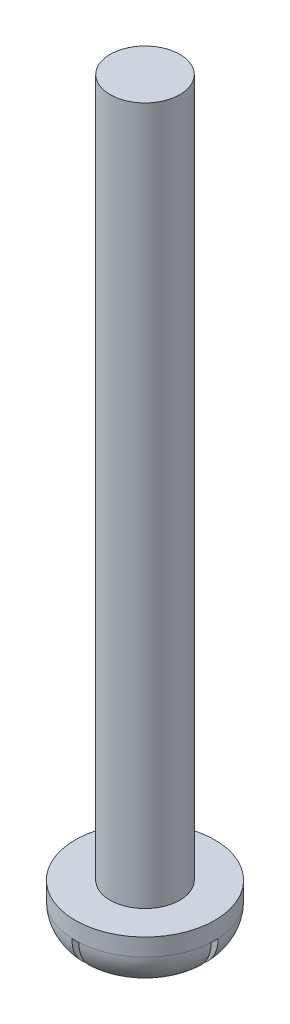
ISO-10303-21;
HEADER;
FILE_DESCRIPTION(('STEP AP214'),'2;1');
FILE_NAME('part.step','',(''),(''),'','','');
FILE_SCHEMA(('AUTOMOTIVE_DESIGN { 1 0 10303 214 1 1 1 1 }'));
ENDSEC;
DATA;
#1=APPLICATION_CONTEXT('core data for automotive mechanical design processes');
#2=APPLICATION_PROTOCOL_DEFINITION('international standard','automotive_design',2000,#1);
#3=PRODUCT_CONTEXT('',#1,'mechanical');
#4=PRODUCT('Part','Part','',(#3));
#5=PRODUCT_RELATED_PRODUCT_CATEGORY('part','',(#4));
#6=PRODUCT_DEFINITION_FORMATION('','',#4);
#7=PRODUCT_DEFINITION_CONTEXT('part definition',#1,'design');
#8=PRODUCT_DEFINITION('design','',#6,#7);
#9=PRODUCT_DEFINITION_SHAPE('','',#8);
#10=(LENGTH_UNIT() NAMED_UNIT(*) SI_UNIT(.MILLI.,.METRE.));
#11=(NAMED_UNIT(*) PLANE_ANGLE_UNIT() SI_UNIT($,.RADIAN.));
#12=(NAMED_UNIT(*) SI_UNIT($,.STERADIAN.) SOLID_ANGLE_UNIT());
#13=UNCERTAINTY_MEASURE_WITH_UNIT(LENGTH_MEASURE(1.E-05),#10,'distance_accuracy_value','');
#14=(GEOMETRIC_REPRESENTATION_CONTEXT(3) GLOBAL_UNCERTAINTY_ASSIGNED_CONTEXT((#13)) GLOBAL_UNIT_ASSIGNED_CONTEXT((#10,
#11,#12)) REPRESENTATION_CONTEXT('',''));
#15=CARTESIAN_POINT('',(0.,0.,0.));
#16=DIRECTION('',(0.,0.,1.));
#17=DIRECTION('',(1.,0.,0.));
#18=AXIS2_PLACEMENT_3D('',#15,#16,#17);
#19=CARTESIAN_POINT('',(0.,-1.5,0.));
#20=DIRECTION('',(0.,1.,0.));
#21=DIRECTION('',(0.,0.,1.));
#22=AXIS2_PLACEMENT_3D('',#19,#20,#21);
#23=CYLINDRICAL_SURFACE('',#22,2.);
#24=CARTESIAN_POINT('',(0.,0.,0.));
#25=DIRECTION('',(0.,1.,0.));
#26=DIRECTION('',(0.,0.,1.));
#27=AXIS2_PLACEMENT_3D('',#24,#25,#26);
#28=CIRCLE('',#27,2.);
#29=CARTESIAN_POINT('',(0.,0.,2.));
#30=VERTEX_POINT('',#29);
#31=EDGE_CURVE('E244',#30,#30,#28,.T.);
#32=ORIENTED_EDGE('',*,*,#31,.F.);
#33=EDGE_LOOP('',(#32));
#34=FACE_BOUND('',#33,.T.);
#35=CARTESIAN_POINT('',(0.,-0.5,0.));
#36=DIRECTION('',(0.,1.,0.));
#37=DIRECTION('',(0.,0.,1.));
#38=AXIS2_PLACEMENT_3D('',#35,#36,#37);
#39=CIRCLE('',#38,2.);
#40=CARTESIAN_POINT('',(0.100000000000001,-0.5,1.99749843554382));
#41=VERTEX_POINT('',#40);
#42=CARTESIAN_POINT('',(-0.0999999999999994,-0.5,1.99749843554382));
#43=VERTEX_POINT('',#42);
#44=EDGE_CURVE('E281',#41,#43,#39,.F.);
#45=ORIENTED_EDGE('',*,*,#44,.F.);
#46=CARTESIAN_POINT('',(0.,-0.5,0.));
#47=DIRECTION('',(0.,1.,0.));
#48=DIRECTION('',(0.,0.,1.));
#49=AXIS2_PLACEMENT_3D('',#46,#47,#48);
#50=CIRCLE('',#49,2.);
#51=CARTESIAN_POINT('',(1.99749843554382,-0.5,0.1));
#52=VERTEX_POINT('',#51);
#53=EDGE_CURVE('E294',#41,#52,#50,.T.);
#54=ORIENTED_EDGE('',*,*,#53,.T.);
#55=CARTESIAN_POINT('',(1.99749843554382,-0.5,-0.1));
#56=VERTEX_POINT('',#55);
#57=EDGE_CURVE('E387',#56,#52,#39,.F.);
#58=ORIENTED_EDGE('',*,*,#57,.F.);
#59=CARTESIAN_POINT('',(0.,-0.5,0.));
#60=DIRECTION('',(0.,1.,0.));
#61=DIRECTION('',(0.,0.,1.));
#62=AXIS2_PLACEMENT_3D('',#59,#60,#61);
#63=CIRCLE('',#62,2.);
#64=CARTESIAN_POINT('',(0.100000000000001,-0.5,-1.99749843554382));
#65=VERTEX_POINT('',#64);
#66=EDGE_CURVE('E282',#56,#65,#63,.T.);
#67=ORIENTED_EDGE('',*,*,#66,.T.);
#68=CARTESIAN_POINT('',(-0.0999999999999994,-0.5,-1.99749843554382));
#69=VERTEX_POINT('',#68);
#70=EDGE_CURVE('E278',#69,#65,#39,.F.);
#71=ORIENTED_EDGE('',*,*,#70,.F.);
#72=CARTESIAN_POINT('',(0.,-0.5,0.));
#73=DIRECTION('',(0.,1.,0.));
#74=DIRECTION('',(0.,0.,1.));
#75=AXIS2_PLACEMENT_3D('',#72,#73,#74);
#76=CIRCLE('',#75,2.);
#77=CARTESIAN_POINT('',(-1.99749843554382,-0.5,-0.1));
#78=VERTEX_POINT('',#77);
#79=EDGE_CURVE('E286',#69,#78,#76,.T.);
#80=ORIENTED_EDGE('',*,*,#79,.T.);
#81=CARTESIAN_POINT('',(-1.99749843554382,-0.5,0.1));
#82=VERTEX_POINT('',#81);
#83=EDGE_CURVE('E196',#82,#78,#39,.F.);
#84=ORIENTED_EDGE('',*,*,#83,.F.);
#85=CARTESIAN_POINT('',(0.,-0.5,0.));
#86=DIRECTION('',(0.,1.,0.));
#87=DIRECTION('',(0.,0.,1.));
#88=AXIS2_PLACEMENT_3D('',#85,#86,#87);
#89=CIRCLE('',#88,2.);
#90=EDGE_CURVE('E290',#82,#43,#89,.T.);
#91=ORIENTED_EDGE('',*,*,#90,.T.);
#92=EDGE_LOOP('',(#45,#54,#58,#67,#71,#80,#84,#91));
#93=FACE_BOUND('',#92,.T.);
#94=ADVANCED_FACE('F91',(#34,#93),#23,.T.);
#95=CARTESIAN_POINT('',(0.,-1.5,0.));
#96=DIRECTION('',(0.,1.,0.));
#97=DIRECTION('',(0.,0.,1.));
#98=AXIS2_PLACEMENT_3D('',#95,#96,#97);
#99=PLANE('',#98);
#100=DIRECTION('',(1.,0.,0.));
#101=VECTOR('',#100,1.);
#102=CARTESIAN_POINT('',(0.,-1.5,-0.1));
#103=LINE('',#102,#101);
#104=CARTESIAN_POINT('',(-0.99498743710662,-1.5,-0.1));
#105=VERTEX_POINT('',#104);
#106=CARTESIAN_POINT('',(-0.0999999999999994,-1.5,-0.1));
#107=VERTEX_POINT('',#106);
#108=EDGE_CURVE('E207',#105,#107,#103,.T.);
#109=ORIENTED_EDGE('',*,*,#108,.F.);
#110=CARTESIAN_POINT('',(0.,-1.5,0.));
#111=DIRECTION('',(0.,1.,0.));
#112=DIRECTION('',(0.,0.,1.));
#113=AXIS2_PLACEMENT_3D('',#110,#111,#112);
#114=CIRCLE('',#113,1.);
#115=CARTESIAN_POINT('',(-0.0999999999999994,-1.5,-0.99498743710662));
#116=VERTEX_POINT('',#115);
#117=EDGE_CURVE('E373',#105,#116,#114,.F.);
#118=ORIENTED_EDGE('',*,*,#117,.T.);
#119=DIRECTION('',(0.,0.,1.));
#120=VECTOR('',#119,1.);
#121=CARTESIAN_POINT('',(-0.0999999999999994,-1.5,0.));
#122=LINE('',#121,#120);
#123=EDGE_CURVE('E273',#116,#107,#122,.T.);
#124=ORIENTED_EDGE('',*,*,#123,.T.);
#125=EDGE_LOOP('',(#109,#118,#124));
#126=FACE_BOUND('',#125,.T.);
#127=ADVANCED_FACE('F410',(#126),#99,.F.);
#128=DIRECTION('',(0.,0.,1.));
#129=VECTOR('',#128,1.);
#130=CARTESIAN_POINT('',(0.100000000000001,-1.5,0.));
#131=LINE('',#130,#129);
#132=CARTESIAN_POINT('',(0.100000000000001,-1.5,-0.99498743710662));
#133=VERTEX_POINT('',#132);
#134=CARTESIAN_POINT('',(0.100000000000001,-1.5,-0.1));
#135=VERTEX_POINT('',#134);
#136=EDGE_CURVE('E267',#133,#135,#131,.T.);
#137=ORIENTED_EDGE('',*,*,#136,.F.);
#138=CARTESIAN_POINT('',(0.,-1.5,0.));
#139=DIRECTION('',(0.,1.,0.));
#140=DIRECTION('',(0.,0.,1.));
#141=AXIS2_PLACEMENT_3D('',#138,#139,#140);
#142=CIRCLE('',#141,1.);
#143=CARTESIAN_POINT('',(0.99498743710662,-1.5,-0.1));
#144=VERTEX_POINT('',#143);
#145=EDGE_CURVE('E106',#133,#144,#142,.F.);
#146=ORIENTED_EDGE('',*,*,#145,.T.);
#147=DIRECTION('',(1.,0.,0.));
#148=VECTOR('',#147,1.);
#149=CARTESIAN_POINT('',(0.,-1.5,-0.1));
#150=LINE('',#149,#148);
#151=EDGE_CURVE('E270',#135,#144,#150,.T.);
#152=ORIENTED_EDGE('',*,*,#151,.F.);
#153=EDGE_LOOP('',(#137,#146,#152));
#154=FACE_BOUND('',#153,.T.);
#155=ADVANCED_FACE('F407',(#154),#99,.F.);
#156=DIRECTION('',(0.,0.,1.));
#157=VECTOR('',#156,1.);
#158=CARTESIAN_POINT('',(-0.0999999999999994,-1.5,0.));
#159=LINE('',#158,#157);
#160=CARTESIAN_POINT('',(-0.0999999999999994,-1.5,0.1));
#161=VERTEX_POINT('',#160);
#162=CARTESIAN_POINT('',(-0.0999999999999994,-1.5,0.99498743710662));
#163=VERTEX_POINT('',#162);
#164=EDGE_CURVE('E260',#161,#163,#159,.T.);
#165=ORIENTED_EDGE('',*,*,#164,.T.);
#166=CARTESIAN_POINT('',(0.,-1.5,0.));
#167=DIRECTION('',(0.,1.,0.));
#168=DIRECTION('',(0.,0.,1.));
#169=AXIS2_PLACEMENT_3D('',#166,#167,#168);
#170=CIRCLE('',#169,1.);
#171=CARTESIAN_POINT('',(-0.99498743710662,-1.5,0.1));
#172=VERTEX_POINT('',#171);
#173=EDGE_CURVE('E333',#163,#172,#170,.F.);
#174=ORIENTED_EDGE('',*,*,#173,.T.);
#175=DIRECTION('',(1.,0.,0.));
#176=VECTOR('',#175,1.);
#177=CARTESIAN_POINT('',(0.,-1.5,0.1));
#178=LINE('',#177,#176);
#179=EDGE_CURVE('E264',#172,#161,#178,.T.);
#180=ORIENTED_EDGE('',*,*,#179,.T.);
#181=EDGE_LOOP('',(#165,#174,#180));
#182=FACE_BOUND('',#181,.T.);
#183=ADVANCED_FACE('F409',(#182),#99,.F.);
#184=DIRECTION('',(1.,0.,0.));
#185=VECTOR('',#184,1.);
#186=CARTESIAN_POINT('',(0.,-1.5,0.1));
#187=LINE('',#186,#185);
#188=CARTESIAN_POINT('',(0.100000000000001,-1.5,0.1));
#189=VERTEX_POINT('',#188);
#190=CARTESIAN_POINT('',(0.99498743710662,-1.5,0.1));
#191=VERTEX_POINT('',#190);
#192=EDGE_CURVE('E256',#189,#191,#187,.T.);
#193=ORIENTED_EDGE('',*,*,#192,.T.);
#194=CARTESIAN_POINT('',(0.,-1.5,0.));
#195=DIRECTION('',(0.,1.,0.));
#196=DIRECTION('',(0.,0.,1.));
#197=AXIS2_PLACEMENT_3D('',#194,#195,#196);
#198=CIRCLE('',#197,1.);
#199=CARTESIAN_POINT('',(0.100000000000001,-1.5,0.99498743710662));
#200=VERTEX_POINT('',#199);
#201=EDGE_CURVE('E307',#191,#200,#198,.F.);
#202=ORIENTED_EDGE('',*,*,#201,.T.);
#203=DIRECTION('',(0.,0.,1.));
#204=VECTOR('',#203,1.);
#205=CARTESIAN_POINT('',(0.100000000000001,-1.5,0.));
#206=LINE('',#205,#204);
#207=EDGE_CURVE('E249',#189,#200,#206,.T.);
#208=ORIENTED_EDGE('',*,*,#207,.F.);
#209=EDGE_LOOP('',(#193,#202,#208));
#210=FACE_BOUND('',#209,.T.);
#211=ADVANCED_FACE('F416',(#210),#99,.F.);
#212=CARTESIAN_POINT('',(0.,0.,0.));
#213=DIRECTION('',(0.,1.,0.));
#214=DIRECTION('',(0.,0.,1.));
#215=AXIS2_PLACEMENT_3D('',#212,#213,#214);
#216=PLANE('',#215);
#217=CARTESIAN_POINT('',(0.,0.,0.));
#218=DIRECTION('',(0.,1.,0.));
#219=DIRECTION('',(0.,0.,1.));
#220=AXIS2_PLACEMENT_3D('',#217,#218,#219);
#221=CIRCLE('',#220,1.);
#222=CARTESIAN_POINT('',(0.,0.,1.));
#223=VERTEX_POINT('',#222);
#224=EDGE_CURVE('E245',#223,#223,#221,.T.);
#225=ORIENTED_EDGE('',*,*,#224,.F.);
#226=EDGE_LOOP('',(#225));
#227=FACE_BOUND('',#226,.T.);
#228=ORIENTED_EDGE('',*,*,#31,.T.);
#229=EDGE_LOOP('',(#228));
#230=FACE_BOUND('',#229,.T.);
#231=ADVANCED_FACE('F426',(#227,#230),#216,.T.);
#232=CARTESIAN_POINT('',(0.,20.,0.));
#233=DIRECTION('',(0.,-1.,0.));
#234=DIRECTION('',(0.,0.,-1.));
#235=AXIS2_PLACEMENT_3D('',#232,#233,#234);
#236=CYLINDRICAL_SURFACE('',#235,1.);
#237=CARTESIAN_POINT('',(0.,20.,0.));
#238=DIRECTION('',(0.,1.,0.));
#239=DIRECTION('',(0.,0.,1.));
#240=AXIS2_PLACEMENT_3D('',#237,#238,#239);
#241=CIRCLE('',#240,1.);
#242=CARTESIAN_POINT('',(0.,20.,1.));
#243=VERTEX_POINT('',#242);
#244=EDGE_CURVE('E240',#243,#243,#241,.T.);
#245=ORIENTED_EDGE('',*,*,#244,.F.);
#246=EDGE_LOOP('',(#245));
#247=FACE_BOUND('',#246,.T.);
#248=ORIENTED_EDGE('',*,*,#224,.T.);
#249=EDGE_LOOP('',(#248));
#250=FACE_BOUND('',#249,.T.);
#251=ADVANCED_FACE('F428',(#247,#250),#236,.T.);
#252=CARTESIAN_POINT('',(0.,20.,0.));
#253=DIRECTION('',(0.,1.,0.));
#254=DIRECTION('',(0.,0.,1.));
#255=AXIS2_PLACEMENT_3D('',#252,#253,#254);
#256=PLANE('',#255);
#257=ORIENTED_EDGE('',*,*,#244,.T.);
#258=EDGE_LOOP('',(#257));
#259=FACE_BOUND('',#258,.T.);
#260=ADVANCED_FACE('F434',(#259),#256,.T.);
#261=CARTESIAN_POINT('',(-2.,-1.500012,-0.1));
#262=DIRECTION('',(0.,0.,1.));
#263=DIRECTION('',(1.,0.,0.));
#264=AXIS2_PLACEMENT_3D('',#261,#262,#263);
#265=PLANE('',#264);
#266=ORIENTED_EDGE('',*,*,#151,.T.);
#267=CARTESIAN_POINT('',(0.99498743710662,-1.5,-0.1));
#268=CARTESIAN_POINT('',(1.02331821335249,-1.49999996996315,-0.1));
#269=CARTESIAN_POINT('',(1.05163574372128,-1.49880729949403,-0.1));
#270=CARTESIAN_POINT('',(1.10806949334507,-1.49404423841916,-0.1));
#271=CARTESIAN_POINT('',(1.13618571633081,-1.49047389199378,-0.1));
#272=CARTESIAN_POINT('',(1.21988656813146,-1.47622212321595,-0.1));
#273=CARTESIAN_POINT('',(1.27491088705168,-1.46199991423278,-0.1));
#274=CARTESIAN_POINT('',(1.38174148327078,-1.42449901310052,-0.1));
#275=CARTESIAN_POINT('',(1.43354825970488,-1.40122172974898,-0.1));
#276=CARTESIAN_POINT('',(1.53248934408289,-1.3462658298641,-0.1));
#277=CARTESIAN_POINT('',(1.57962477580312,-1.31458924070805,-0.1));
#278=CARTESIAN_POINT('',(1.66767253400877,-1.24389143883173,-0.1));
#279=CARTESIAN_POINT('',(1.70861157005451,-1.20490347144944,-0.1));
#280=CARTESIAN_POINT('',(1.78335661557813,-1.12058583135484,-0.1));
#281=CARTESIAN_POINT('',(1.81716117995925,-1.07525487694834,-0.1));
#282=CARTESIAN_POINT('',(1.87660367590102,-0.979639850735611,-0.1));
#283=CARTESIAN_POINT('',(1.90225596538467,-0.929364693613435,-0.1));
#284=CARTESIAN_POINT('',(1.94473328913296,-0.8252293358305,-0.1));
#285=CARTESIAN_POINT('',(1.96156378507989,-0.771371376660514,-0.1));
#286=CARTESIAN_POINT('',(1.98164141439204,-0.680974380367145,-0.1));
#287=CARTESIAN_POINT('',(1.98758443417955,-0.645011214276785,-0.1));
#288=CARTESIAN_POINT('',(1.99551223727195,-0.572703786776848,-0.1));
#289=CARTESIAN_POINT('',(1.99750271237168,-0.536360149241403,-0.1));
#290=CARTESIAN_POINT('',(1.99749843554382,-0.5,-0.1));
#291=B_SPLINE_CURVE_WITH_KNOTS('',3,(#267,#268,#269,#270,#271,#272,#273,#274,#275,#276,#277,
#278,#279,#280,#281,#282,#283,#284,#285,#286,#287,#288,#289,#290),.UNSPECIFIED.,.F.,.F.,(4,2,2,
2,2,2,2,2,2,2,2,4),(0.,0.0849406781167001,0.169879777966962,0.339498799069642,0.509091441222281,
0.678643185259543,0.847441880548863,1.01627473349505,1.18480856578623,1.35323793306923,
1.46238903653949,1.57138284450026),.UNSPECIFIED.);
#292=EDGE_CURVE('E12',#144,#56,#291,.T.);
#293=ORIENTED_EDGE('',*,*,#292,.T.);
#294=DIRECTION('',(1.,0.,0.));
#295=VECTOR('',#294,1.);
#296=CARTESIAN_POINT('',(-2.,-0.5,-0.1));
#297=LINE('',#296,#295);
#298=CARTESIAN_POINT('',(0.100000000000001,-0.5,-0.1));
#299=VERTEX_POINT('',#298);
#300=EDGE_CURVE('E200',#299,#56,#297,.T.);
#301=ORIENTED_EDGE('',*,*,#300,.F.);
#302=DIRECTION('',(0.,-1.,0.));
#303=VECTOR('',#302,1.);
#304=CARTESIAN_POINT('',(0.100000000000001,-1.500012,-0.1));
#305=LINE('',#304,#303);
#306=EDGE_CURVE('E236',#299,#135,#305,.T.);
#307=ORIENTED_EDGE('',*,*,#306,.T.);
#308=EDGE_LOOP('',(#266,#293,#301,#307));
#309=FACE_BOUND('',#308,.T.);
#310=ADVANCED_FACE('F406',(#309),#265,.T.);
#311=CARTESIAN_POINT('',(-2.,-1.500012,0.1));
#312=DIRECTION('',(0.,0.,1.));
#313=DIRECTION('',(1.,0.,0.));
#314=AXIS2_PLACEMENT_3D('',#311,#312,#313);
#315=PLANE('',#314);
#316=DIRECTION('',(1.,0.,0.));
#317=VECTOR('',#316,1.);
#318=CARTESIAN_POINT('',(-2.,-0.5,0.1));
#319=LINE('',#318,#317);
#320=CARTESIAN_POINT('',(0.100000000000001,-0.5,0.1));
#321=VERTEX_POINT('',#320);
#322=EDGE_CURVE('E199',#321,#52,#319,.T.);
#323=ORIENTED_EDGE('',*,*,#322,.T.);
#324=CARTESIAN_POINT('',(1.99749843554382,-0.5,0.1));
#325=CARTESIAN_POINT('',(1.99749825777726,-0.52810497117014,0.1));
#326=CARTESIAN_POINT('',(1.99631137236725,-0.556196473310876,0.1));
#327=CARTESIAN_POINT('',(1.99157646779227,-0.612178350224322,0.1));
#328=CARTESIAN_POINT('',(1.98802856501171,-0.640068734842457,0.1));
#329=CARTESIAN_POINT('',(1.97387739169901,-0.723088328365686,0.1));
#330=CARTESIAN_POINT('',(1.95976656055544,-0.777661262583887,0.1));
#331=CARTESIAN_POINT('',(1.92258420158717,-0.883661678381409,0.1));
#332=CARTESIAN_POINT('',(1.89950843274077,-0.935087657890615,0.1));
#333=CARTESIAN_POINT('',(1.84505575517323,-1.03333625867376,0.1));
#334=CARTESIAN_POINT('',(1.81368022911593,-1.08015964491736,0.1));
#335=CARTESIAN_POINT('',(1.74350874081588,-1.16789261192876,0.1));
#336=CARTESIAN_POINT('',(1.70471028588486,-1.20880019799029,0.1));
#337=CARTESIAN_POINT('',(1.62079459523457,-1.28353742932022,0.1));
#338=CARTESIAN_POINT('',(1.57567622567505,-1.31736580180238,0.1));
#339=CARTESIAN_POINT('',(1.48035328650548,-1.37702242580202,0.1));
#340=CARTESIAN_POINT('',(1.430142224407,-1.4028402905005,0.1));
#341=CARTESIAN_POINT('',(1.32611336664471,-1.44569000774303,0.1));
#342=CARTESIAN_POINT('',(1.27229745582206,-1.46272641188821,0.1));
#343=CARTESIAN_POINT('',(1.18097080491316,-1.48341130577798,0.1));
#344=CARTESIAN_POINT('',(1.14402144742461,-1.48963123557399,0.1));
#345=CARTESIAN_POINT('',(1.06971520300602,-1.49792535280229,0.1));
#346=CARTESIAN_POINT('',(1.03235899379958,-1.50000561152962,0.1));
#347=CARTESIAN_POINT('',(0.99498743710662,-1.5,0.1));
#348=B_SPLINE_CURVE_WITH_KNOTS('',3,(#324,#325,#326,#327,#328,#329,#330,#331,#332,#333,#334,
#335,#336,#337,#338,#339,#340,#341,#342,#343,#344,#345,#346,#347),.UNSPECIFIED.,.F.,.F.,(4,2,2,
2,2,2,2,2,2,2,2,4),(0.,0.0842631084806962,0.168522063588081,0.336757756437839,0.50507313324711,
0.673360487888784,0.841704454490896,1.01007866204348,1.17867028820165,1.34717444196047,
1.45936544193442,1.57139177951544),.UNSPECIFIED.);
#349=EDGE_CURVE('E298',#52,#191,#348,.T.);
#350=ORIENTED_EDGE('',*,*,#349,.T.);
#351=ORIENTED_EDGE('',*,*,#192,.F.);
#352=DIRECTION('',(0.,-1.,0.));
#353=VECTOR('',#352,1.);
#354=CARTESIAN_POINT('',(0.100000000000001,-1.500012,0.1));
#355=LINE('',#354,#353);
#356=EDGE_CURVE('E233',#321,#189,#355,.T.);
#357=ORIENTED_EDGE('',*,*,#356,.F.);
#358=EDGE_LOOP('',(#323,#350,#351,#357));
#359=FACE_BOUND('',#358,.T.);
#360=ADVANCED_FACE('F318',(#359),#315,.F.);
#361=CARTESIAN_POINT('',(-0.0999999999999994,-0.5,-0.1));
#362=VERTEX_POINT('',#361);
#363=EDGE_CURVE('E187',#78,#362,#297,.T.);
#364=ORIENTED_EDGE('',*,*,#363,.F.);
#365=CARTESIAN_POINT('',(-1.99749843554382,-0.5,-0.1));
#366=CARTESIAN_POINT('',(-1.99749825777726,-0.52810497117014,-0.1));
#367=CARTESIAN_POINT('',(-1.99631137236725,-0.556196473310876,-0.1));
#368=CARTESIAN_POINT('',(-1.99157646779227,-0.612178350224322,-0.1));
#369=CARTESIAN_POINT('',(-1.98802856501171,-0.640068734842457,-0.1));
#370=CARTESIAN_POINT('',(-1.97387739169901,-0.723088328365686,-0.1));
#371=CARTESIAN_POINT('',(-1.95976656055544,-0.777661262583887,-0.1));
#372=CARTESIAN_POINT('',(-1.92258420158717,-0.883661678381409,-0.1));
#373=CARTESIAN_POINT('',(-1.89950843274077,-0.935087657890615,-0.1));
#374=CARTESIAN_POINT('',(-1.84505575517323,-1.03333625867376,-0.1));
#375=CARTESIAN_POINT('',(-1.81368022911593,-1.08015964491736,-0.1));
#376=CARTESIAN_POINT('',(-1.74350874081588,-1.16789261192876,-0.1));
#377=CARTESIAN_POINT('',(-1.70471028588486,-1.20880019799029,-0.1));
#378=CARTESIAN_POINT('',(-1.62079459523457,-1.28353742932022,-0.1));
#379=CARTESIAN_POINT('',(-1.57567622567505,-1.31736580180238,-0.1));
#380=CARTESIAN_POINT('',(-1.48035328650548,-1.37702242580202,-0.1));
#381=CARTESIAN_POINT('',(-1.430142224407,-1.4028402905005,-0.1));
#382=CARTESIAN_POINT('',(-1.32611336664471,-1.44569000774303,-0.1));
#383=CARTESIAN_POINT('',(-1.27229745582206,-1.46272641188821,-0.1));
#384=CARTESIAN_POINT('',(-1.18097080491316,-1.48341130577798,-0.1));
#385=CARTESIAN_POINT('',(-1.14402144742461,-1.48963123557399,-0.1));
#386=CARTESIAN_POINT('',(-1.06971520300602,-1.49792535280229,-0.1));
#387=CARTESIAN_POINT('',(-1.03235899379958,-1.50000561152962,-0.1));
#388=CARTESIAN_POINT('',(-0.99498743710662,-1.5,-0.1));
#389=B_SPLINE_CURVE_WITH_KNOTS('',3,(#365,#366,#367,#368,#369,#370,#371,#372,#373,#374,#375,
#376,#377,#378,#379,#380,#381,#382,#383,#384,#385,#386,#387,#388),.UNSPECIFIED.,.F.,.F.,(4,2,2,
2,2,2,2,2,2,2,2,4),(0.,0.0842631084806962,0.168522063588081,0.336757756437839,0.50507313324711,
0.673360487888784,0.841704454490896,1.01007866204348,1.17867028820165,1.34717444196047,
1.45936544193442,1.57139177951544),.UNSPECIFIED.);
#390=EDGE_CURVE('E332',#78,#105,#389,.T.);
#391=ORIENTED_EDGE('',*,*,#390,.T.);
#392=ORIENTED_EDGE('',*,*,#108,.T.);
#393=DIRECTION('',(0.,1.,0.));
#394=VECTOR('',#393,1.);
#395=CARTESIAN_POINT('',(-0.0999999999999994,-0.5,-0.1));
#396=LINE('',#395,#394);
#397=EDGE_CURVE('E204',#107,#362,#396,.T.);
#398=ORIENTED_EDGE('',*,*,#397,.T.);
#399=EDGE_LOOP('',(#364,#391,#392,#398));
#400=FACE_BOUND('',#399,.T.);
#401=ADVANCED_FACE('F205',(#400),#265,.T.);
#402=ORIENTED_EDGE('',*,*,#179,.F.);
#403=CARTESIAN_POINT('',(-0.99498743710662,-1.5,0.1));
#404=CARTESIAN_POINT('',(-1.02331821335249,-1.49999996996315,0.1));
#405=CARTESIAN_POINT('',(-1.05163574372128,-1.49880729949403,0.1));
#406=CARTESIAN_POINT('',(-1.10806949334507,-1.49404423841916,0.1));
#407=CARTESIAN_POINT('',(-1.13618571633081,-1.49047389199378,0.1));
#408=CARTESIAN_POINT('',(-1.21988656813146,-1.47622212321595,0.1));
#409=CARTESIAN_POINT('',(-1.27491088705168,-1.46199991423278,0.1));
#410=CARTESIAN_POINT('',(-1.38174148327078,-1.42449901310052,0.1));
#411=CARTESIAN_POINT('',(-1.43354825970488,-1.40122172974898,0.1));
#412=CARTESIAN_POINT('',(-1.53248934408289,-1.3462658298641,0.1));
#413=CARTESIAN_POINT('',(-1.57962477580312,-1.31458924070805,0.1));
#414=CARTESIAN_POINT('',(-1.66767253400877,-1.24389143883173,0.1));
#415=CARTESIAN_POINT('',(-1.70861157005451,-1.20490347144944,0.1));
#416=CARTESIAN_POINT('',(-1.78335661557813,-1.12058583135484,0.1));
#417=CARTESIAN_POINT('',(-1.81716117995925,-1.07525487694834,0.1));
#418=CARTESIAN_POINT('',(-1.87660367590102,-0.979639850735611,0.1));
#419=CARTESIAN_POINT('',(-1.90225596538467,-0.929364693613435,0.1));
#420=CARTESIAN_POINT('',(-1.94473328913296,-0.8252293358305,0.1));
#421=CARTESIAN_POINT('',(-1.96156378507989,-0.771371376660514,0.1));
#422=CARTESIAN_POINT('',(-1.98164141439204,-0.680974380367145,0.1));
#423=CARTESIAN_POINT('',(-1.98758443417955,-0.645011214276785,0.1));
#424=CARTESIAN_POINT('',(-1.99551223727195,-0.572703786776848,0.1));
#425=CARTESIAN_POINT('',(-1.99750271237168,-0.536360149241403,0.1));
#426=CARTESIAN_POINT('',(-1.99749843554382,-0.5,0.1));
#427=B_SPLINE_CURVE_WITH_KNOTS('',3,(#403,#404,#405,#406,#407,#408,#409,#410,#411,#412,#413,
#414,#415,#416,#417,#418,#419,#420,#421,#422,#423,#424,#425,#426),.UNSPECIFIED.,.F.,.F.,(4,2,2,
2,2,2,2,2,2,2,2,4),(0.,0.0849406781167001,0.169879777966962,0.339498799069642,0.509091441222281,
0.678643185259543,0.847441880548863,1.01627473349505,1.18480856578623,1.35323793306923,
1.46238903653949,1.57138284450026),.UNSPECIFIED.);
#428=EDGE_CURVE('E324',#172,#82,#427,.T.);
#429=ORIENTED_EDGE('',*,*,#428,.T.);
#430=CARTESIAN_POINT('',(-0.0999999999999994,-0.5,0.1));
#431=VERTEX_POINT('',#430);
#432=EDGE_CURVE('E230',#82,#431,#319,.T.);
#433=ORIENTED_EDGE('',*,*,#432,.T.);
#434=DIRECTION('',(0.,1.,0.));
#435=VECTOR('',#434,1.);
#436=CARTESIAN_POINT('',(-0.0999999999999994,-0.5,0.1));
#437=LINE('',#436,#435);
#438=EDGE_CURVE('E211',#161,#431,#437,.T.);
#439=ORIENTED_EDGE('',*,*,#438,.F.);
#440=EDGE_LOOP('',(#402,#429,#433,#439));
#441=FACE_BOUND('',#440,.T.);
#442=ADVANCED_FACE('F313',(#441),#315,.F.);
#443=CARTESIAN_POINT('',(-0.0999999999999994,-0.5,2.));
#444=DIRECTION('',(-1.,0.,0.));
#445=DIRECTION('',(0.,0.,1.));
#446=AXIS2_PLACEMENT_3D('',#443,#444,#445);
#447=PLANE('',#446);
#448=ORIENTED_EDGE('',*,*,#123,.F.);
#449=CARTESIAN_POINT('',(-0.0999999999999994,-1.5,-0.99498743710662));
#450=CARTESIAN_POINT('',(-0.0999999999999994,-1.49999996996315,-1.02331821335249));
#451=CARTESIAN_POINT('',(-0.0999999999999994,-1.49880729949403,-1.05163574372128));
#452=CARTESIAN_POINT('',(-0.0999999999999994,-1.49404423841916,-1.10806949334507));
#453=CARTESIAN_POINT('',(-0.0999999999999994,-1.49047389199378,-1.13618571633081));
#454=CARTESIAN_POINT('',(-0.0999999999999994,-1.47622212321595,-1.21988656813146));
#455=CARTESIAN_POINT('',(-0.0999999999999994,-1.46199991423278,-1.27491088705168));
#456=CARTESIAN_POINT('',(-0.0999999999999994,-1.42449901310052,-1.38174148327078));
#457=CARTESIAN_POINT('',(-0.0999999999999994,-1.40122172974898,-1.43354825970488));
#458=CARTESIAN_POINT('',(-0.0999999999999994,-1.3462658298641,-1.53248934408289));
#459=CARTESIAN_POINT('',(-0.0999999999999994,-1.31458924070805,-1.57962477580312));
#460=CARTESIAN_POINT('',(-0.0999999999999994,-1.24389143883173,-1.66767253400877));
#461=CARTESIAN_POINT('',(-0.0999999999999994,-1.20490347144944,-1.70861157005451));
#462=CARTESIAN_POINT('',(-0.0999999999999994,-1.12058583135484,-1.78335661557813));
#463=CARTESIAN_POINT('',(-0.0999999999999994,-1.07525487694834,-1.81716117995925));
#464=CARTESIAN_POINT('',(-0.0999999999999994,-0.979639850735612,-1.87660367590101));
#465=CARTESIAN_POINT('',(-0.0999999999999994,-0.929364693613435,-1.90225596538467));
#466=CARTESIAN_POINT('',(-0.0999999999999994,-0.8252293358305,-1.94473328913296));
#467=CARTESIAN_POINT('',(-0.0999999999999994,-0.771371376660514,-1.96156378507989));
#468=CARTESIAN_POINT('',(-0.0999999999999994,-0.680974380367145,-1.98164141439204));
#469=CARTESIAN_POINT('',(-0.0999999999999994,-0.645011214276785,-1.98758443417955));
#470=CARTESIAN_POINT('',(-0.0999999999999994,-0.572703786776848,-1.99551223727195));
#471=CARTESIAN_POINT('',(-0.0999999999999994,-0.536360149241403,-1.99750271237168));
#472=CARTESIAN_POINT('',(-0.0999999999999994,-0.5,-1.99749843554382));
#473=B_SPLINE_CURVE_WITH_KNOTS('',3,(#449,#450,#451,#452,#453,#454,#455,#456,#457,#458,#459,
#460,#461,#462,#463,#464,#465,#466,#467,#468,#469,#470,#471,#472),.UNSPECIFIED.,.F.,.F.,(4,2,2,
2,2,2,2,2,2,2,2,4),(0.,0.0849406781167001,0.169879777966962,0.339498799069642,0.509091441222281,
0.678643185259543,0.847441880548863,1.01627473349505,1.18480856578623,1.35323793306923,
1.46238903653949,1.57138284450026),.UNSPECIFIED.);
#474=EDGE_CURVE('E215',#116,#69,#473,.T.);
#475=ORIENTED_EDGE('',*,*,#474,.T.);
#476=DIRECTION('',(0.,0.,1.));
#477=VECTOR('',#476,1.);
#478=CARTESIAN_POINT('',(-0.0999999999999994,-0.5,2.));
#479=LINE('',#478,#477);
#480=EDGE_CURVE('E193',#362,#69,#479,.F.);
#481=ORIENTED_EDGE('',*,*,#480,.F.);
#482=ORIENTED_EDGE('',*,*,#397,.F.);
#483=EDGE_LOOP('',(#448,#475,#481,#482));
#484=FACE_BOUND('',#483,.T.);
#485=ADVANCED_FACE('F213',(#484),#447,.F.);
#486=CARTESIAN_POINT('',(0.100000000000001,-0.5,2.));
#487=DIRECTION('',(-1.,0.,0.));
#488=DIRECTION('',(0.,0.,1.));
#489=AXIS2_PLACEMENT_3D('',#486,#487,#488);
#490=PLANE('',#489);
#491=DIRECTION('',(0.,0.,1.));
#492=VECTOR('',#491,1.);
#493=CARTESIAN_POINT('',(0.100000000000001,-0.5,2.));
#494=LINE('',#493,#492);
#495=EDGE_CURVE('E222',#299,#65,#494,.F.);
#496=ORIENTED_EDGE('',*,*,#495,.T.);
#497=CARTESIAN_POINT('',(0.100000000000001,-0.5,-1.99749843554382));
#498=CARTESIAN_POINT('',(0.100000000000001,-0.52810497117014,-1.99749825777726));
#499=CARTESIAN_POINT('',(0.100000000000001,-0.556196473310876,-1.99631137236725));
#500=CARTESIAN_POINT('',(0.100000000000001,-0.612178350224322,-1.99157646779227));
#501=CARTESIAN_POINT('',(0.100000000000001,-0.640068734842457,-1.98802856501171));
#502=CARTESIAN_POINT('',(0.100000000000001,-0.723088328365686,-1.97387739169901));
#503=CARTESIAN_POINT('',(0.100000000000001,-0.777661262583887,-1.95976656055544));
#504=CARTESIAN_POINT('',(0.100000000000001,-0.883661678381409,-1.92258420158717));
#505=CARTESIAN_POINT('',(0.100000000000001,-0.935087657890615,-1.89950843274077));
#506=CARTESIAN_POINT('',(0.100000000000001,-1.03333625867376,-1.84505575517323));
#507=CARTESIAN_POINT('',(0.100000000000001,-1.08015964491736,-1.81368022911593));
#508=CARTESIAN_POINT('',(0.100000000000001,-1.16789261192876,-1.74350874081588));
#509=CARTESIAN_POINT('',(0.100000000000001,-1.20880019799029,-1.70471028588486));
#510=CARTESIAN_POINT('',(0.100000000000001,-1.28353742932022,-1.62079459523457));
#511=CARTESIAN_POINT('',(0.100000000000001,-1.31736580180238,-1.57567622567505));
#512=CARTESIAN_POINT('',(0.100000000000001,-1.37702242580202,-1.48035328650548));
#513=CARTESIAN_POINT('',(0.100000000000001,-1.4028402905005,-1.430142224407));
#514=CARTESIAN_POINT('',(0.100000000000001,-1.44569000774303,-1.32611336664471));
#515=CARTESIAN_POINT('',(0.100000000000001,-1.46272641188821,-1.27229745582206));
#516=CARTESIAN_POINT('',(0.100000000000001,-1.48341130577798,-1.18097080491316));
#517=CARTESIAN_POINT('',(0.100000000000001,-1.48963123557399,-1.14402144742461));
#518=CARTESIAN_POINT('',(0.100000000000001,-1.49792535280229,-1.06971520300602));
#519=CARTESIAN_POINT('',(0.100000000000001,-1.50000561152962,-1.03235899379958));
#520=CARTESIAN_POINT('',(0.100000000000001,-1.5,-0.99498743710662));
#521=B_SPLINE_CURVE_WITH_KNOTS('',3,(#497,#498,#499,#500,#501,#502,#503,#504,#505,#506,#507,
#508,#509,#510,#511,#512,#513,#514,#515,#516,#517,#518,#519,#520),.UNSPECIFIED.,.F.,.F.,(4,2,2,
2,2,2,2,2,2,2,2,4),(0.,0.0842631084806959,0.168522063588081,0.336757756437839,0.505073133247109,
0.673360487888783,0.841704454490896,1.01007866204348,1.17867028820165,1.34717444196047,
1.45936544193442,1.57139177951544),.UNSPECIFIED.);
#522=EDGE_CURVE('E120',#65,#133,#521,.T.);
#523=ORIENTED_EDGE('',*,*,#522,.T.);
#524=ORIENTED_EDGE('',*,*,#136,.T.);
#525=ORIENTED_EDGE('',*,*,#306,.F.);
#526=EDGE_LOOP('',(#496,#523,#524,#525));
#527=FACE_BOUND('',#526,.T.);
#528=ADVANCED_FACE('F397',(#527),#490,.T.);
#529=CARTESIAN_POINT('',(0.,-0.5,0.));
#530=DIRECTION('',(0.,1.,0.));
#531=DIRECTION('',(-1.,0.,0.));
#532=AXIS2_PLACEMENT_3D('',#529,#530,#531);
#533=PLANE('',#532);
#534=ORIENTED_EDGE('',*,*,#432,.F.);
#535=ORIENTED_EDGE('',*,*,#83,.T.);
#536=ORIENTED_EDGE('',*,*,#363,.T.);
#537=ORIENTED_EDGE('',*,*,#480,.T.);
#538=ORIENTED_EDGE('',*,*,#70,.T.);
#539=ORIENTED_EDGE('',*,*,#495,.F.);
#540=ORIENTED_EDGE('',*,*,#300,.T.);
#541=ORIENTED_EDGE('',*,*,#57,.T.);
#542=ORIENTED_EDGE('',*,*,#322,.F.);
#543=EDGE_CURVE('E224',#41,#321,#494,.F.);
#544=ORIENTED_EDGE('',*,*,#543,.F.);
#545=ORIENTED_EDGE('',*,*,#44,.T.);
#546=EDGE_CURVE('E218',#43,#431,#479,.F.);
#547=ORIENTED_EDGE('',*,*,#546,.T.);
#548=EDGE_LOOP('',(#534,#535,#536,#537,#538,#539,#540,#541,#542,#544,#545,#547));
#549=FACE_BOUND('',#548,.T.);
#550=ADVANCED_FACE('F190',(#549),#533,.F.);
#551=ORIENTED_EDGE('',*,*,#546,.F.);
#552=CARTESIAN_POINT('',(-0.0999999999999994,-0.5,1.99749843554382));
#553=CARTESIAN_POINT('',(-0.0999999999999994,-0.52810497117014,1.99749825777726));
#554=CARTESIAN_POINT('',(-0.0999999999999994,-0.556196473310876,1.99631137236725));
#555=CARTESIAN_POINT('',(-0.0999999999999994,-0.612178350224322,1.99157646779227));
#556=CARTESIAN_POINT('',(-0.0999999999999994,-0.640068734842457,1.98802856501171));
#557=CARTESIAN_POINT('',(-0.0999999999999994,-0.723088328365686,1.97387739169901));
#558=CARTESIAN_POINT('',(-0.0999999999999994,-0.777661262583887,1.95976656055544));
#559=CARTESIAN_POINT('',(-0.0999999999999994,-0.883661678381409,1.92258420158717));
#560=CARTESIAN_POINT('',(-0.0999999999999994,-0.935087657890615,1.89950843274077));
#561=CARTESIAN_POINT('',(-0.0999999999999994,-1.03333625867376,1.84505575517323));
#562=CARTESIAN_POINT('',(-0.0999999999999994,-1.08015964491736,1.81368022911593));
#563=CARTESIAN_POINT('',(-0.0999999999999994,-1.16789261192876,1.74350874081588));
#564=CARTESIAN_POINT('',(-0.0999999999999994,-1.20880019799029,1.70471028588486));
#565=CARTESIAN_POINT('',(-0.0999999999999994,-1.28353742932022,1.62079459523457));
#566=CARTESIAN_POINT('',(-0.0999999999999994,-1.31736580180238,1.57567622567505));
#567=CARTESIAN_POINT('',(-0.0999999999999994,-1.37702242580202,1.48035328650548));
#568=CARTESIAN_POINT('',(-0.0999999999999994,-1.4028402905005,1.430142224407));
#569=CARTESIAN_POINT('',(-0.0999999999999994,-1.44569000774303,1.32611336664471));
#570=CARTESIAN_POINT('',(-0.0999999999999994,-1.46272641188821,1.27229745582206));
#571=CARTESIAN_POINT('',(-0.0999999999999994,-1.48341130577798,1.18097080491316));
#572=CARTESIAN_POINT('',(-0.0999999999999994,-1.48963123557399,1.14402144742461));
#573=CARTESIAN_POINT('',(-0.0999999999999994,-1.49792535280229,1.06971520300602));
#574=CARTESIAN_POINT('',(-0.0999999999999994,-1.50000561152962,1.03235899379958));
#575=CARTESIAN_POINT('',(-0.0999999999999994,-1.5,0.99498743710662));
#576=B_SPLINE_CURVE_WITH_KNOTS('',3,(#552,#553,#554,#555,#556,#557,#558,#559,#560,#561,#562,
#563,#564,#565,#566,#567,#568,#569,#570,#571,#572,#573,#574,#575),.UNSPECIFIED.,.F.,.F.,(4,2,2,
2,2,2,2,2,2,2,2,4),(0.,0.0842631084806962,0.168522063588081,0.336757756437839,0.50507313324711,
0.673360487888783,0.841704454490896,1.01007866204348,1.17867028820165,1.34717444196047,
1.45936544193442,1.57139177951544),.UNSPECIFIED.);
#577=EDGE_CURVE('E347',#43,#163,#576,.T.);
#578=ORIENTED_EDGE('',*,*,#577,.T.);
#579=ORIENTED_EDGE('',*,*,#164,.F.);
#580=ORIENTED_EDGE('',*,*,#438,.T.);
#581=EDGE_LOOP('',(#551,#578,#579,#580));
#582=FACE_BOUND('',#581,.T.);
#583=ADVANCED_FACE('F359',(#582),#447,.F.);
#584=ORIENTED_EDGE('',*,*,#207,.T.);
#585=CARTESIAN_POINT('',(0.100000000000001,-1.5,0.99498743710662));
#586=CARTESIAN_POINT('',(0.100000000000001,-1.49999996996316,1.02331821335249));
#587=CARTESIAN_POINT('',(0.100000000000001,-1.49880729949403,1.05163574372128));
#588=CARTESIAN_POINT('',(0.100000000000001,-1.49404423841916,1.10806949334507));
#589=CARTESIAN_POINT('',(0.100000000000001,-1.49047389199379,1.13618571633081));
#590=CARTESIAN_POINT('',(0.100000000000001,-1.47622212321595,1.21988656813146));
#591=CARTESIAN_POINT('',(0.100000000000001,-1.46199991423278,1.27491088705168));
#592=CARTESIAN_POINT('',(0.100000000000001,-1.42449901310052,1.38174148327078));
#593=CARTESIAN_POINT('',(0.100000000000001,-1.40122172974898,1.43354825970488));
#594=CARTESIAN_POINT('',(0.100000000000001,-1.3462658298641,1.53248934408289));
#595=CARTESIAN_POINT('',(0.100000000000001,-1.31458924070805,1.57962477580312));
#596=CARTESIAN_POINT('',(0.100000000000001,-1.24389143883173,1.66767253400877));
#597=CARTESIAN_POINT('',(0.100000000000001,-1.20490347144944,1.70861157005451));
#598=CARTESIAN_POINT('',(0.100000000000001,-1.12058583135484,1.78335661557813));
#599=CARTESIAN_POINT('',(0.100000000000001,-1.07525487694834,1.81716117995925));
#600=CARTESIAN_POINT('',(0.100000000000001,-0.979639850735612,1.87660367590101));
#601=CARTESIAN_POINT('',(0.100000000000001,-0.929364693613435,1.90225596538467));
#602=CARTESIAN_POINT('',(0.100000000000001,-0.8252293358305,1.94473328913296));
#603=CARTESIAN_POINT('',(0.100000000000001,-0.771371376660514,1.96156378507989));
#604=CARTESIAN_POINT('',(0.100000000000001,-0.680974380367145,1.98164141439204));
#605=CARTESIAN_POINT('',(0.100000000000001,-0.645011214276785,1.98758443417955));
#606=CARTESIAN_POINT('',(0.100000000000001,-0.572703786776848,1.99551223727195));
#607=CARTESIAN_POINT('',(0.100000000000001,-0.536360149241403,1.99750271237168));
#608=CARTESIAN_POINT('',(0.100000000000001,-0.5,1.99749843554382));
#609=B_SPLINE_CURVE_WITH_KNOTS('',3,(#585,#586,#587,#588,#589,#590,#591,#592,#593,#594,#595,
#596,#597,#598,#599,#600,#601,#602,#603,#604,#605,#606,#607,#608),.UNSPECIFIED.,.F.,.F.,(4,2,2,
2,2,2,2,2,2,2,2,4),(0.,0.0849406781166999,0.169879777966962,0.339498799069642,0.509091441222281,
0.678643185259543,0.847441880548863,1.01627473349505,1.18480856578623,1.35323793306923,
1.46238903653949,1.57138284450026),.UNSPECIFIED.);
#610=EDGE_CURVE('E353',#200,#41,#609,.T.);
#611=ORIENTED_EDGE('',*,*,#610,.T.);
#612=ORIENTED_EDGE('',*,*,#543,.T.);
#613=ORIENTED_EDGE('',*,*,#356,.T.);
#614=EDGE_LOOP('',(#584,#611,#612,#613));
#615=FACE_BOUND('',#614,.T.);
#616=ADVANCED_FACE('F362',(#615),#490,.T.);
#617=CARTESIAN_POINT('',(0.,-0.5,0.));
#618=DIRECTION('',(0.,1.,0.));
#619=DIRECTION('',(0.,0.,1.));
#620=AXIS2_PLACEMENT_3D('',#617,#618,#619);
#621=DEGENERATE_TOROIDAL_SURFACE('',#620,1.,1.,.T.);
#622=ORIENTED_EDGE('',*,*,#610,.F.);
#623=ORIENTED_EDGE('',*,*,#201,.F.);
#624=ORIENTED_EDGE('',*,*,#349,.F.);
#625=ORIENTED_EDGE('',*,*,#53,.F.);
#626=EDGE_LOOP('',(#622,#623,#624,#625));
#627=FACE_BOUND('',#626,.T.);
#628=ADVANCED_FACE('F309',(#627),#621,.T.);
#629=CARTESIAN_POINT('',(0.,-0.5,0.));
#630=DIRECTION('',(0.,1.,0.));
#631=DIRECTION('',(0.,0.,1.));
#632=AXIS2_PLACEMENT_3D('',#629,#630,#631);
#633=DEGENERATE_TOROIDAL_SURFACE('',#632,1.,1.,.T.);
#634=ORIENTED_EDGE('',*,*,#428,.F.);
#635=ORIENTED_EDGE('',*,*,#173,.F.);
#636=ORIENTED_EDGE('',*,*,#577,.F.);
#637=ORIENTED_EDGE('',*,*,#90,.F.);
#638=EDGE_LOOP('',(#634,#635,#636,#637));
#639=FACE_BOUND('',#638,.T.);
#640=ADVANCED_FACE('F340',(#639),#633,.T.);
#641=CARTESIAN_POINT('',(0.,-0.5,0.));
#642=DIRECTION('',(0.,1.,0.));
#643=DIRECTION('',(0.,0.,1.));
#644=AXIS2_PLACEMENT_3D('',#641,#642,#643);
#645=DEGENERATE_TOROIDAL_SURFACE('',#644,1.,1.,.T.);
#646=ORIENTED_EDGE('',*,*,#474,.F.);
#647=ORIENTED_EDGE('',*,*,#117,.F.);
#648=ORIENTED_EDGE('',*,*,#390,.F.);
#649=ORIENTED_EDGE('',*,*,#79,.F.);
#650=EDGE_LOOP('',(#646,#647,#648,#649));
#651=FACE_BOUND('',#650,.T.);
#652=ADVANCED_FACE('F343',(#651),#645,.T.);
#653=CARTESIAN_POINT('',(0.,-0.5,0.));
#654=DIRECTION('',(0.,1.,0.));
#655=DIRECTION('',(0.,0.,1.));
#656=AXIS2_PLACEMENT_3D('',#653,#654,#655);
#657=DEGENERATE_TOROIDAL_SURFACE('',#656,1.,1.,.T.);
#658=ORIENTED_EDGE('',*,*,#292,.F.);
#659=ORIENTED_EDGE('',*,*,#145,.F.);
#660=ORIENTED_EDGE('',*,*,#522,.F.);
#661=ORIENTED_EDGE('',*,*,#66,.F.);
#662=EDGE_LOOP('',(#658,#659,#660,#661));
#663=FACE_BOUND('',#662,.T.);
#664=ADVANCED_FACE('F93',(#663),#657,.T.);
#665=CLOSED_SHELL('',(#94,#127,#155,#183,#211,#231,#251,#260,#310,#360,#401,#442,#485,#528,#550,
#583,#616,#628,#640,#652,#664));
#666=MANIFOLD_SOLID_BREP('B2',#665);
#667=ADVANCED_BREP_SHAPE_REPRESENTATION('',(#18,#666),#14);
#668=SHAPE_DEFINITION_REPRESENTATION(#9,#667);
ENDSEC;
END-ISO-10303-21;
